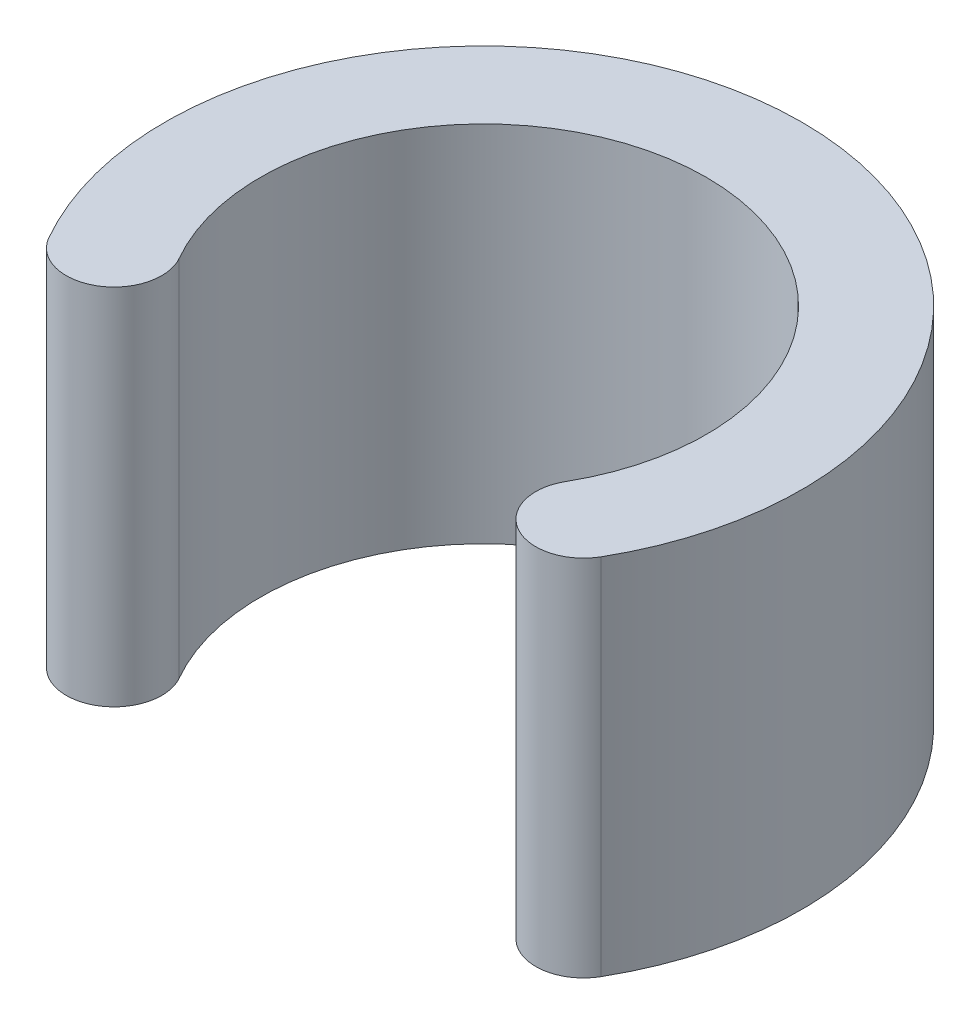
ISO-10303-21;
HEADER;
FILE_DESCRIPTION(('STEP AP214'),'2;1');
FILE_NAME('part.step','',(''),(''),'','','');
FILE_SCHEMA(('AUTOMOTIVE_DESIGN { 1 0 10303 214 1 1 1 1 }'));
ENDSEC;
DATA;
#1=APPLICATION_CONTEXT('core data for automotive mechanical design processes');
#2=APPLICATION_PROTOCOL_DEFINITION('international standard','automotive_design',2000,#1);
#3=PRODUCT_CONTEXT('',#1,'mechanical');
#4=PRODUCT('Part','Part','',(#3));
#5=PRODUCT_RELATED_PRODUCT_CATEGORY('part','',(#4));
#6=PRODUCT_DEFINITION_FORMATION('','',#4);
#7=PRODUCT_DEFINITION_CONTEXT('part definition',#1,'design');
#8=PRODUCT_DEFINITION('design','',#6,#7);
#9=PRODUCT_DEFINITION_SHAPE('','',#8);
#10=(LENGTH_UNIT() NAMED_UNIT(*) SI_UNIT(.MILLI.,.METRE.));
#11=(NAMED_UNIT(*) PLANE_ANGLE_UNIT() SI_UNIT($,.RADIAN.));
#12=(NAMED_UNIT(*) SI_UNIT($,.STERADIAN.) SOLID_ANGLE_UNIT());
#13=UNCERTAINTY_MEASURE_WITH_UNIT(LENGTH_MEASURE(1.E-05),#10,'distance_accuracy_value','');
#14=(GEOMETRIC_REPRESENTATION_CONTEXT(3) GLOBAL_UNCERTAINTY_ASSIGNED_CONTEXT((#13)) GLOBAL_UNIT_ASSIGNED_CONTEXT((#10,
#11,#12)) REPRESENTATION_CONTEXT('',''));
#15=CARTESIAN_POINT('',(0.,0.,0.));
#16=DIRECTION('',(0.,0.,1.));
#17=DIRECTION('',(1.,0.,0.));
#18=AXIS2_PLACEMENT_3D('',#15,#16,#17);
#19=CARTESIAN_POINT('',(8.67455183011166,12.562,4.97515331891455));
#20=CARTESIAN_POINT('',(8.67455183011166,12.1813333333333,4.97515331891455));
#21=CARTESIAN_POINT('',(8.67455183011888,11.8006666666667,4.97515331890196));
#22=CARTESIAN_POINT('',(8.67455183011888,7.61333333333282,4.97515331890196));
#23=CARTESIAN_POINT('',(8.67455183011888,3.80666666666842,4.97515331890196));
#24=CARTESIAN_POINT('',(8.67455183011888,-0.380666666666843,4.97515331890196));
#25=CARTESIAN_POINT('',(8.67455183011166,-0.761333333333193,4.97515331891455));
#26=CARTESIAN_POINT('',(8.67455183011166,-1.142,4.97515331891455));
#27=CARTESIAN_POINT('',(8.17703649822173,12.562,5.84260850192886));
#28=CARTESIAN_POINT('',(8.17703649822305,12.1813333333333,5.84260850192952));
#29=CARTESIAN_POINT('',(8.17703649823359,11.8006666666667,5.84260850192343));
#30=CARTESIAN_POINT('',(8.17703649822996,7.61333333333282,5.84260850192162));
#31=CARTESIAN_POINT('',(8.17703649823326,3.80666666666862,5.84260850192327));
#32=CARTESIAN_POINT('',(8.17703649823326,-0.380666666666862,5.84260850192327));
#33=CARTESIAN_POINT('',(8.17703649822173,-0.761333333333178,5.84260850192886));
#34=CARTESIAN_POINT('',(8.17703649822173,-1.142,5.84260850192886));
#35=CARTESIAN_POINT('',(6.90455094609621,12.562,6.55379098178102));
#36=CARTESIAN_POINT('',(6.90455094609555,12.1813333333335,6.55379098178168));
#37=CARTESIAN_POINT('',(6.90455094610297,11.8006666666664,6.55379098179103));
#38=CARTESIAN_POINT('',(6.90455094610479,7.61333333333613,6.55379098178921));
#39=CARTESIAN_POINT('',(6.90455094610314,3.80666666666887,6.55379098179086));
#40=CARTESIAN_POINT('',(6.90455094610314,-0.380666666666887,6.55379098179086));
#41=CARTESIAN_POINT('',(6.90455094609621,-0.761333333333159,6.55379098178102));
#42=CARTESIAN_POINT('',(6.90455094609621,-1.142,6.55379098178102));
#43=CARTESIAN_POINT('',(5.60336817157444,12.562,5.80751798394183));
#44=CARTESIAN_POINT('',(5.60336817157444,12.1813333333335,5.80751798394249));
#45=CARTESIAN_POINT('',(5.60336817157024,11.8006666666664,5.80751798394973));
#46=CARTESIAN_POINT('',(5.60336817157024,7.61333333333613,5.80751798394791));
#47=CARTESIAN_POINT('',(5.60336817157024,3.80666666666887,5.80751798394956));
#48=CARTESIAN_POINT('',(5.60336817157024,-0.380666666666887,5.80751798394956));
#49=CARTESIAN_POINT('',(5.60336817157444,-0.761333333333159,5.80751798394183));
#50=CARTESIAN_POINT('',(5.60336817157444,-1.142,5.80751798394183));
#51=CARTESIAN_POINT('',(5.57467094918335,12.562,4.35006250625345));
#52=CARTESIAN_POINT('',(5.57467094918269,12.1813333333333,4.35006250625345));
#53=CARTESIAN_POINT('',(5.57467094918278,11.8006666666667,4.35006250624955));
#54=CARTESIAN_POINT('',(5.5746709491846,7.61333333333282,4.35006250624955));
#55=CARTESIAN_POINT('',(5.57467094918294,3.80666666666862,4.35006250624955));
#56=CARTESIAN_POINT('',(5.57467094918294,-0.380666666666862,4.35006250624955));
#57=CARTESIAN_POINT('',(5.57467094918335,-0.761333333333178,4.35006250625345));
#58=CARTESIAN_POINT('',(5.57467094918335,-1.142,4.35006250625345));
#59=CARTESIAN_POINT('',(6.0721862810774,12.562,3.48260732324151));
#60=CARTESIAN_POINT('',(6.0721862810774,12.1813333333333,3.48260732324151));
#61=CARTESIAN_POINT('',(6.07218628108094,11.8006666666667,3.48260732323534));
#62=CARTESIAN_POINT('',(6.07218628108094,7.61333333333282,3.48260732323534));
#63=CARTESIAN_POINT('',(6.07218628108094,3.80666666666842,3.48260732323534));
#64=CARTESIAN_POINT('',(6.07218628108094,-0.380666666666843,3.48260732323534));
#65=CARTESIAN_POINT('',(6.0721862810774,-0.761333333333193,3.48260732324151));
#66=CARTESIAN_POINT('',(6.0721862810774,-1.142,3.48260732324151));
#67=(BOUNDED_SURFACE() B_SPLINE_SURFACE(5,3,((#19,#20,#21,#22,#23,#24,#25,#26),(#27,#28,#29,#30,
#31,#32,#33,#34),(#35,#36,#37,#38,#39,#40,#41,#42),(#43,#44,#45,#46,#47,#48,#49,#50),(#51,#52,
#53,#54,#55,#56,#57,#58),(#59,#60,#61,#62,#63,#64,#65,#66)),.UNSPECIFIED.,.F.,.F.,
.F.) B_SPLINE_SURFACE_WITH_KNOTS((6,6),(4,2,2,4),(0.,1.),(-0.1,0.,1.,1.1),
.UNSPECIFIED.) GEOMETRIC_REPRESENTATION_ITEM() RATIONAL_B_SPLINE_SURFACE(((1.,1.,1.,1.,1.,1.,1.,
1.),(0.599999999999049,0.599999999999049,0.599999999997145,0.599999999997145,0.599999999997145,
0.599999999997145,0.599999999999049,0.599999999999049),(0.399999999998573,0.399999999998573,
0.399999999995718,0.399999999995718,0.399999999995718,0.399999999995718,0.399999999998573,
0.399999999998573),(0.399999999998573,0.399999999998573,0.399999999995718,0.399999999995718,
0.399999999995718,0.399999999995718,0.399999999998573,0.399999999998573),(0.599999999999049,
0.599999999999049,0.599999999997145,0.599999999997145,0.599999999997145,0.599999999997145,
0.599999999999049,0.599999999999049),(1.,1.,1.,1.,1.,1.,1.,1.))) REPRESENTATION_ITEM('') SURFACE());
#68=CARTESIAN_POINT('',(6.0721862810774,12.562,3.48260732324151));
#69=CARTESIAN_POINT('',(6.0721862810774,12.1813333333333,3.48260732324151));
#70=CARTESIAN_POINT('',(6.07218628108094,11.8006666666667,3.48260732323534));
#71=CARTESIAN_POINT('',(6.07218628108094,7.61333333333282,3.48260732323534));
#72=CARTESIAN_POINT('',(6.07218628108094,3.80666666666842,3.48260732323534));
#73=CARTESIAN_POINT('',(6.07218628108094,-0.380666666666843,3.48260732323534));
#74=CARTESIAN_POINT('',(6.0721862810774,-0.761333333333193,3.48260732324151));
#75=CARTESIAN_POINT('',(6.0721862810774,-1.142,3.48260732324151));
#76=(BOUNDED_CURVE() B_SPLINE_CURVE(3,(#68,#69,#70,#71,#72,#73,#74,#75),.UNSPECIFIED.,.F.,
.F.) B_SPLINE_CURVE_WITH_KNOTS((4,2,2,4),(-0.1,0.,1.,1.1),
.UNSPECIFIED.) CURVE() GEOMETRIC_REPRESENTATION_ITEM() RATIONAL_B_SPLINE_CURVE((1.,1.,1.,1.,1.,
1.,1.,1.)) REPRESENTATION_ITEM(''));
#77=CARTESIAN_POINT('',(6.07218628108094,0.,3.48260732323534));
#78=VERTEX_POINT('',#77);
#79=CARTESIAN_POINT('',(6.07218628108094,11.42,3.48260732323534));
#80=VERTEX_POINT('',#79);
#81=EDGE_CURVE('E97',#78,#80,#76,.F.);
#82=CARTESIAN_POINT('',(6.07218628108094,0.,3.48260732323534));
#83=CARTESIAN_POINT('',(5.57467094918295,0.,4.35006250624955));
#84=CARTESIAN_POINT('',(5.60336817157024,0.,5.80751798394956));
#85=CARTESIAN_POINT('',(6.90455094610314,0.,6.55379098179086));
#86=CARTESIAN_POINT('',(8.17703649823327,0.,5.84260850192327));
#87=CARTESIAN_POINT('',(8.67455183011888,0.,4.97515331890196));
#88=(BOUNDED_CURVE() B_SPLINE_CURVE(5,(#82,#83,#84,#85,#86,#87),.UNSPECIFIED.,.F.,
.F.) B_SPLINE_CURVE_WITH_KNOTS((6,6),(0.,1.),
.UNSPECIFIED.) CURVE() GEOMETRIC_REPRESENTATION_ITEM() RATIONAL_B_SPLINE_CURVE((1.,
0.599999999997145,0.399999999995718,0.399999999995718,0.599999999997145,1.)) REPRESENTATION_ITEM(''));
#89=CARTESIAN_POINT('',(8.67455183011888,0.,4.97515331890196));
#90=VERTEX_POINT('',#89);
#91=EDGE_CURVE('E58',#90,#78,#88,.F.);
#92=CARTESIAN_POINT('',(8.67455183011166,-1.142,4.97515331891455));
#93=CARTESIAN_POINT('',(8.67455183011166,-0.761333333333193,4.97515331891455));
#94=CARTESIAN_POINT('',(8.67455183011888,-0.380666666666843,4.97515331890196));
#95=CARTESIAN_POINT('',(8.67455183011888,3.80666666666842,4.97515331890196));
#96=CARTESIAN_POINT('',(8.67455183011888,7.61333333333282,4.97515331890196));
#97=CARTESIAN_POINT('',(8.67455183011888,11.8006666666667,4.97515331890196));
#98=CARTESIAN_POINT('',(8.67455183011166,12.1813333333333,4.97515331891455));
#99=CARTESIAN_POINT('',(8.67455183011166,12.562,4.97515331891455));
#100=(BOUNDED_CURVE() B_SPLINE_CURVE(3,(#92,#93,#94,#95,#96,#97,#98,#99),.UNSPECIFIED.,.F.,
.F.) B_SPLINE_CURVE_WITH_KNOTS((4,2,2,4),(-0.1,0.,1.,1.1),
.UNSPECIFIED.) CURVE() GEOMETRIC_REPRESENTATION_ITEM() RATIONAL_B_SPLINE_CURVE((1.,1.,1.,1.,1.,
1.,1.,1.)) REPRESENTATION_ITEM(''));
#101=CARTESIAN_POINT('',(8.67455183011888,11.42,4.97515331890196));
#102=VERTEX_POINT('',#101);
#103=EDGE_CURVE('E186',#102,#90,#100,.F.);
#104=CARTESIAN_POINT('',(8.67455183011888,11.42,4.97515331890196));
#105=CARTESIAN_POINT('',(8.17703649823326,11.42,5.84260850192327));
#106=CARTESIAN_POINT('',(6.90455094610314,11.42,6.55379098179086));
#107=CARTESIAN_POINT('',(5.60336817157024,11.42,5.80751798394956));
#108=CARTESIAN_POINT('',(5.57467094918294,11.42,4.35006250624955));
#109=CARTESIAN_POINT('',(6.07218628108094,11.42,3.48260732323534));
#110=(BOUNDED_CURVE() B_SPLINE_CURVE(5,(#104,#105,#106,#107,#108,#109),.UNSPECIFIED.,.F.,
.F.) B_SPLINE_CURVE_WITH_KNOTS((6,6),(0.,1.),
.UNSPECIFIED.) CURVE() GEOMETRIC_REPRESENTATION_ITEM() RATIONAL_B_SPLINE_CURVE((1.,
0.599999999997145,0.399999999995718,0.399999999995718,0.599999999997145,1.)) REPRESENTATION_ITEM(''));
#111=EDGE_CURVE('E11',#80,#102,#110,.F.);
#112=ORIENTED_EDGE('',*,*,#81,.F.);
#113=ORIENTED_EDGE('',*,*,#91,.F.);
#114=ORIENTED_EDGE('',*,*,#103,.F.);
#115=ORIENTED_EDGE('',*,*,#111,.F.);
#116=EDGE_LOOP('',(#112,#113,#114,#115));
#117=FACE_BOUND('',#116,.T.);
#118=ADVANCED_FACE('F45',(#117),#67,.T.);
#119=CARTESIAN_POINT('',(-8.67455183011005,-1.142,4.97515331891735));
#120=CARTESIAN_POINT('',(-8.67455183011005,-0.761333333333543,4.97515331891735));
#121=CARTESIAN_POINT('',(-8.67455183011392,-0.380666666666387,4.97515331891061));
#122=CARTESIAN_POINT('',(-8.67455183011392,3.80666666666387,4.97515331891061));
#123=CARTESIAN_POINT('',(-8.67455183011392,7.61333333333158,4.97515331891061));
#124=CARTESIAN_POINT('',(-8.67455183011392,11.8006666666668,4.97515331891061));
#125=CARTESIAN_POINT('',(-8.67455183011005,12.1813333333332,4.97515331891735));
#126=CARTESIAN_POINT('',(-8.67455183011005,12.562,4.97515331891735));
#127=CARTESIAN_POINT('',(-8.17703649821914,-1.142,5.84260850193004));
#128=CARTESIAN_POINT('',(-8.17703649822046,-0.761333333333565,5.84260850193004));
#129=CARTESIAN_POINT('',(-8.17703649822531,-0.380666666666357,5.84260850192705));
#130=CARTESIAN_POINT('',(-8.17703649822531,3.80666666666357,5.84260850192705));
#131=CARTESIAN_POINT('',(-8.17703649822531,7.61333333333158,5.84260850192705));
#132=CARTESIAN_POINT('',(-8.17703649822531,11.8006666666668,5.84260850192705));
#133=CARTESIAN_POINT('',(-8.17703649821914,12.1813333333332,5.84260850193004));
#134=CARTESIAN_POINT('',(-8.17703649821914,12.562,5.84260850193004));
#135=CARTESIAN_POINT('',(-6.90455094609471,-1.142,6.55379098177864));
#136=CARTESIAN_POINT('',(-6.90455094609603,-0.761333333333593,6.55379098177864));
#137=CARTESIAN_POINT('',(-6.90455094609841,-0.38066666666632,6.5537909817839));
#138=CARTESIAN_POINT('',(-6.90455094609841,3.8066666666632,6.5537909817839));
#139=CARTESIAN_POINT('',(-6.90455094609841,7.61333333333157,6.5537909817839));
#140=CARTESIAN_POINT('',(-6.90455094609841,11.8006666666668,6.5537909817839));
#141=CARTESIAN_POINT('',(-6.90455094609471,12.1813333333332,6.55379098177864));
#142=CARTESIAN_POINT('',(-6.90455094609471,12.562,6.55379098177864));
#143=CARTESIAN_POINT('',(-5.60336817157551,-1.142,5.80751798393996));
#144=CARTESIAN_POINT('',(-5.60336817157419,-0.761333333333593,5.8075179839393));
#145=CARTESIAN_POINT('',(-5.60336817157325,-0.38066666666632,5.8075179839441));
#146=CARTESIAN_POINT('',(-5.60336817157325,3.8066666666632,5.8075179839441));
#147=CARTESIAN_POINT('',(-5.60336817157325,7.61333333333157,5.8075179839441));
#148=CARTESIAN_POINT('',(-5.60336817157325,11.8006666666668,5.8075179839441));
#149=CARTESIAN_POINT('',(-5.60336817157551,12.1813333333332,5.80751798393996));
#150=CARTESIAN_POINT('',(-5.60336817157551,12.562,5.80751798393996));
#151=CARTESIAN_POINT('',(-5.5746709491835,-1.142,4.35006250625428));
#152=CARTESIAN_POINT('',(-5.57467094918284,-0.761333333333565,4.35006250625428));
#153=CARTESIAN_POINT('',(-5.57467094918329,-0.380666666666357,4.35006250625219));
#154=CARTESIAN_POINT('',(-5.57467094918329,3.80666666666357,4.35006250625219));
#155=CARTESIAN_POINT('',(-5.57467094918329,7.61333333333158,4.35006250625219));
#156=CARTESIAN_POINT('',(-5.57467094918329,11.8006666666668,4.35006250625219));
#157=CARTESIAN_POINT('',(-5.5746709491835,12.1813333333332,4.35006250625428));
#158=CARTESIAN_POINT('',(-5.5746709491835,12.562,4.35006250625428));
#159=CARTESIAN_POINT('',(-6.07218628107663,-1.142,3.48260732324286));
#160=CARTESIAN_POINT('',(-6.07218628107663,-0.761333333333543,3.48260732324286));
#161=CARTESIAN_POINT('',(-6.07218628107853,-0.380666666666387,3.48260732323955));
#162=CARTESIAN_POINT('',(-6.07218628107853,3.80666666666387,3.48260732323955));
#163=CARTESIAN_POINT('',(-6.07218628107853,7.61333333333158,3.48260732323955));
#164=CARTESIAN_POINT('',(-6.07218628107853,11.8006666666668,3.48260732323955));
#165=CARTESIAN_POINT('',(-6.07218628107663,12.1813333333332,3.48260732324286));
#166=CARTESIAN_POINT('',(-6.07218628107663,12.562,3.48260732324286));
#167=(BOUNDED_SURFACE() B_SPLINE_SURFACE(5,3,((#119,#120,#121,#122,#123,#124,#125,#126),(#127,
#128,#129,#130,#131,#132,#133,#134),(#135,#136,#137,#138,#139,#140,#141,#142),(#143,#144,#145,
#146,#147,#148,#149,#150),(#151,#152,#153,#154,#155,#156,#157,#158),(#159,#160,#161,#162,#163,
#164,#165,#166)),.UNSPECIFIED.,.F.,.F.,.F.) B_SPLINE_SURFACE_WITH_KNOTS((6,6),(4,2,2,4),(0.,1.),
(-0.1,0.,1.,1.1),.UNSPECIFIED.) GEOMETRIC_REPRESENTATION_ITEM() RATIONAL_B_SPLINE_SURFACE(((1.,
1.,1.,1.,1.,1.,1.,1.),(0.59999999999949,0.59999999999949,0.599999999998471,0.599999999998471,
0.599999999998471,0.599999999998471,0.59999999999949,0.59999999999949),(0.399999999999235,
0.399999999999235,0.399999999997707,0.399999999997707,0.399999999997707,0.399999999997707,
0.399999999999235,0.399999999999235),(0.399999999999235,0.399999999999235,0.399999999997707,
0.399999999997707,0.399999999997707,0.399999999997707,0.399999999999235,0.399999999999235),
(0.59999999999949,0.59999999999949,0.599999999998471,0.599999999998471,0.599999999998471,
0.599999999998471,0.59999999999949,0.59999999999949),(1.,1.,1.,1.,1.,1.,1.,1.))) REPRESENTATION_ITEM('') SURFACE());
#168=CARTESIAN_POINT('',(-6.07218628107663,-1.142,3.48260732324286));
#169=CARTESIAN_POINT('',(-6.07218628107663,-0.761333333333543,3.48260732324286));
#170=CARTESIAN_POINT('',(-6.07218628107853,-0.380666666666387,3.48260732323955));
#171=CARTESIAN_POINT('',(-6.07218628107853,3.80666666666387,3.48260732323955));
#172=CARTESIAN_POINT('',(-6.07218628107853,7.61333333333158,3.48260732323955));
#173=CARTESIAN_POINT('',(-6.07218628107853,11.8006666666668,3.48260732323955));
#174=CARTESIAN_POINT('',(-6.07218628107663,12.1813333333332,3.48260732324286));
#175=CARTESIAN_POINT('',(-6.07218628107663,12.562,3.48260732324286));
#176=(BOUNDED_CURVE() B_SPLINE_CURVE(3,(#168,#169,#170,#171,#172,#173,#174,#175),.UNSPECIFIED.,
.F.,.F.) B_SPLINE_CURVE_WITH_KNOTS((4,2,2,4),(-0.1,0.,1.,1.1),
.UNSPECIFIED.) CURVE() GEOMETRIC_REPRESENTATION_ITEM() RATIONAL_B_SPLINE_CURVE((1.,1.,1.,1.,1.,
1.,1.,1.)) REPRESENTATION_ITEM(''));
#177=CARTESIAN_POINT('',(-6.07218628107853,11.42,3.48260732323955));
#178=VERTEX_POINT('',#177);
#179=CARTESIAN_POINT('',(-6.07218628107853,0.,3.48260732323955));
#180=VERTEX_POINT('',#179);
#181=EDGE_CURVE('E95',#178,#180,#176,.F.);
#182=CARTESIAN_POINT('',(-6.07218628107853,11.42,3.48260732323955));
#183=CARTESIAN_POINT('',(-5.57467094918329,11.42,4.35006250625219));
#184=CARTESIAN_POINT('',(-5.60336817157325,11.42,5.8075179839441));
#185=CARTESIAN_POINT('',(-6.90455094609841,11.42,6.5537909817839));
#186=CARTESIAN_POINT('',(-8.17703649822531,11.42,5.84260850192705));
#187=CARTESIAN_POINT('',(-8.67455183011392,11.42,4.97515331891061));
#188=(BOUNDED_CURVE() B_SPLINE_CURVE(5,(#182,#183,#184,#185,#186,#187),.UNSPECIFIED.,.F.,
.F.) B_SPLINE_CURVE_WITH_KNOTS((6,6),(0.,1.),
.UNSPECIFIED.) CURVE() GEOMETRIC_REPRESENTATION_ITEM() RATIONAL_B_SPLINE_CURVE((1.,
0.599999999998471,0.399999999997707,0.399999999997707,0.599999999998471,1.)) REPRESENTATION_ITEM(''));
#189=CARTESIAN_POINT('',(-8.67455183011392,11.42,4.97515331891061));
#190=VERTEX_POINT('',#189);
#191=EDGE_CURVE('E103',#190,#178,#188,.F.);
#192=CARTESIAN_POINT('',(-8.67455183011005,12.562,4.97515331891735));
#193=CARTESIAN_POINT('',(-8.67455183011005,12.1813333333332,4.97515331891735));
#194=CARTESIAN_POINT('',(-8.67455183011392,11.8006666666668,4.97515331891061));
#195=CARTESIAN_POINT('',(-8.67455183011392,7.61333333333158,4.97515331891061));
#196=CARTESIAN_POINT('',(-8.67455183011392,3.80666666666387,4.97515331891061));
#197=CARTESIAN_POINT('',(-8.67455183011392,-0.380666666666387,4.97515331891061));
#198=CARTESIAN_POINT('',(-8.67455183011005,-0.761333333333543,4.97515331891735));
#199=CARTESIAN_POINT('',(-8.67455183011005,-1.142,4.97515331891735));
#200=(BOUNDED_CURVE() B_SPLINE_CURVE(3,(#192,#193,#194,#195,#196,#197,#198,#199),.UNSPECIFIED.,
.F.,.F.) B_SPLINE_CURVE_WITH_KNOTS((4,2,2,4),(-0.1,0.,1.,1.1),
.UNSPECIFIED.) CURVE() GEOMETRIC_REPRESENTATION_ITEM() RATIONAL_B_SPLINE_CURVE((1.,1.,1.,1.,1.,
1.,1.,1.)) REPRESENTATION_ITEM(''));
#201=CARTESIAN_POINT('',(-8.67455183011392,0.,4.97515331891061));
#202=VERTEX_POINT('',#201);
#203=EDGE_CURVE('E113',#202,#190,#200,.F.);
#204=CARTESIAN_POINT('',(-8.67455183011392,0.,4.97515331891061));
#205=CARTESIAN_POINT('',(-8.17703649822531,0.,5.84260850192705));
#206=CARTESIAN_POINT('',(-6.90455094609841,0.,6.5537909817839));
#207=CARTESIAN_POINT('',(-5.60336817157325,0.,5.8075179839441));
#208=CARTESIAN_POINT('',(-5.57467094918329,0.,4.35006250625219));
#209=CARTESIAN_POINT('',(-6.07218628107853,0.,3.48260732323955));
#210=(BOUNDED_CURVE() B_SPLINE_CURVE(5,(#204,#205,#206,#207,#208,#209),.UNSPECIFIED.,.F.,
.F.) B_SPLINE_CURVE_WITH_KNOTS((6,6),(0.,1.),
.UNSPECIFIED.) CURVE() GEOMETRIC_REPRESENTATION_ITEM() RATIONAL_B_SPLINE_CURVE((1.,
0.599999999998471,0.399999999997707,0.399999999997707,0.599999999998471,1.)) REPRESENTATION_ITEM(''));
#211=EDGE_CURVE('E112',#180,#202,#210,.F.);
#212=ORIENTED_EDGE('',*,*,#181,.F.);
#213=ORIENTED_EDGE('',*,*,#191,.F.);
#214=ORIENTED_EDGE('',*,*,#203,.F.);
#215=ORIENTED_EDGE('',*,*,#211,.F.);
#216=EDGE_LOOP('',(#212,#213,#214,#215));
#217=FACE_BOUND('',#216,.T.);
#218=ADVANCED_FACE('F118',(#217),#167,.T.);
#219=CARTESIAN_POINT('',(0.,11.42,0.));
#220=DIRECTION('',(0.,1.,0.));
#221=DIRECTION('',(0.,0.,1.));
#222=AXIS2_PLACEMENT_3D('',#219,#220,#221);
#223=PLANE('',#222);
#224=CARTESIAN_POINT('',(0.,11.42,0.));
#225=DIRECTION('',(0.,1.,0.));
#226=DIRECTION('',(0.,0.,1.));
#227=AXIS2_PLACEMENT_3D('',#224,#225,#226);
#228=CIRCLE('',#227,7.);
#229=EDGE_CURVE('E90',#80,#178,#228,.T.);
#230=ORIENTED_EDGE('',*,*,#229,.F.);
#231=ORIENTED_EDGE('',*,*,#111,.T.);
#232=CARTESIAN_POINT('',(0.,11.42,0.));
#233=DIRECTION('',(0.,1.,0.));
#234=DIRECTION('',(0.,0.,1.));
#235=AXIS2_PLACEMENT_3D('',#232,#233,#234);
#236=CIRCLE('',#235,10.);
#237=EDGE_CURVE('E107',#102,#190,#236,.T.);
#238=ORIENTED_EDGE('',*,*,#237,.T.);
#239=ORIENTED_EDGE('',*,*,#191,.T.);
#240=EDGE_LOOP('',(#230,#231,#238,#239));
#241=FACE_BOUND('',#240,.T.);
#242=ADVANCED_FACE('F105',(#241),#223,.T.);
#243=CARTESIAN_POINT('',(0.,0.,0.));
#244=DIRECTION('',(0.,1.,0.));
#245=DIRECTION('',(0.,0.,1.));
#246=AXIS2_PLACEMENT_3D('',#243,#244,#245);
#247=PLANE('',#246);
#248=CARTESIAN_POINT('',(0.,0.,0.));
#249=DIRECTION('',(0.,1.,0.));
#250=DIRECTION('',(0.,0.,1.));
#251=AXIS2_PLACEMENT_3D('',#248,#249,#250);
#252=CIRCLE('',#251,10.);
#253=EDGE_CURVE('E99',#90,#202,#252,.T.);
#254=ORIENTED_EDGE('',*,*,#253,.F.);
#255=ORIENTED_EDGE('',*,*,#91,.T.);
#256=CARTESIAN_POINT('',(0.,0.,0.));
#257=DIRECTION('',(0.,1.,0.));
#258=DIRECTION('',(0.,0.,1.));
#259=AXIS2_PLACEMENT_3D('',#256,#257,#258);
#260=CIRCLE('',#259,7.);
#261=EDGE_CURVE('E100',#78,#180,#260,.T.);
#262=ORIENTED_EDGE('',*,*,#261,.T.);
#263=ORIENTED_EDGE('',*,*,#211,.T.);
#264=EDGE_LOOP('',(#254,#255,#262,#263));
#265=FACE_BOUND('',#264,.T.);
#266=ADVANCED_FACE('F201',(#265),#247,.F.);
#267=CARTESIAN_POINT('',(0.,11.42,0.));
#268=DIRECTION('',(0.,-1.,0.));
#269=DIRECTION('',(0.,0.,-1.));
#270=AXIS2_PLACEMENT_3D('',#267,#268,#269);
#271=CYLINDRICAL_SURFACE('',#270,10.);
#272=ORIENTED_EDGE('',*,*,#237,.F.);
#273=ORIENTED_EDGE('',*,*,#103,.T.);
#274=ORIENTED_EDGE('',*,*,#253,.T.);
#275=ORIENTED_EDGE('',*,*,#203,.T.);
#276=EDGE_LOOP('',(#272,#273,#274,#275));
#277=FACE_BOUND('',#276,.T.);
#278=ADVANCED_FACE('F143',(#277),#271,.T.);
#279=CARTESIAN_POINT('',(0.,11.42,0.));
#280=DIRECTION('',(0.,-1.,0.));
#281=DIRECTION('',(0.,0.,-1.));
#282=AXIS2_PLACEMENT_3D('',#279,#280,#281);
#283=CYLINDRICAL_SURFACE('',#282,7.);
#284=ORIENTED_EDGE('',*,*,#261,.F.);
#285=ORIENTED_EDGE('',*,*,#81,.T.);
#286=ORIENTED_EDGE('',*,*,#229,.T.);
#287=ORIENTED_EDGE('',*,*,#181,.T.);
#288=EDGE_LOOP('',(#284,#285,#286,#287));
#289=FACE_BOUND('',#288,.T.);
#290=ADVANCED_FACE('F93',(#289),#283,.F.);
#291=CLOSED_SHELL('',(#118,#218,#242,#266,#278,#290));
#292=MANIFOLD_SOLID_BREP('B2',#291);
#293=ADVANCED_BREP_SHAPE_REPRESENTATION('',(#18,#292),#14);
#294=SHAPE_DEFINITION_REPRESENTATION(#9,#293);
ENDSEC;
END-ISO-10303-21;
